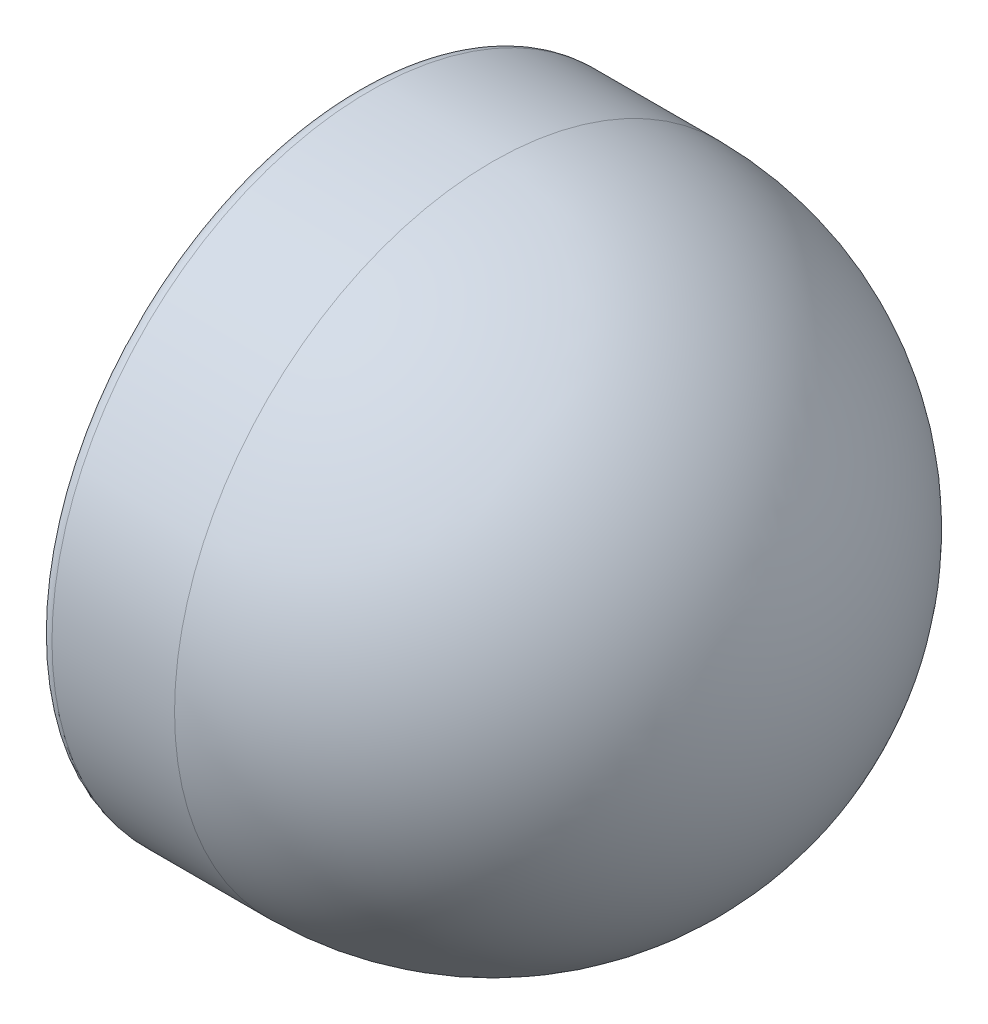
ISO-10303-21;
HEADER;
FILE_DESCRIPTION(('STEP AP214'),'2;1');
FILE_NAME('part.step','',(''),(''),'','','');
FILE_SCHEMA(('AUTOMOTIVE_DESIGN { 1 0 10303 214 1 1 1 1 }'));
ENDSEC;
DATA;
#1=APPLICATION_CONTEXT('core data for automotive mechanical design processes');
#2=APPLICATION_PROTOCOL_DEFINITION('international standard','automotive_design',2000,#1);
#3=PRODUCT_CONTEXT('',#1,'mechanical');
#4=PRODUCT('Part','Part','',(#3));
#5=PRODUCT_RELATED_PRODUCT_CATEGORY('part','',(#4));
#6=PRODUCT_DEFINITION_FORMATION('','',#4);
#7=PRODUCT_DEFINITION_CONTEXT('part definition',#1,'design');
#8=PRODUCT_DEFINITION('design','',#6,#7);
#9=PRODUCT_DEFINITION_SHAPE('','',#8);
#10=(LENGTH_UNIT() NAMED_UNIT(*) SI_UNIT(.MILLI.,.METRE.));
#11=(NAMED_UNIT(*) PLANE_ANGLE_UNIT() SI_UNIT($,.RADIAN.));
#12=(NAMED_UNIT(*) SI_UNIT($,.STERADIAN.) SOLID_ANGLE_UNIT());
#13=UNCERTAINTY_MEASURE_WITH_UNIT(LENGTH_MEASURE(1.E-05),#10,'distance_accuracy_value','');
#14=(GEOMETRIC_REPRESENTATION_CONTEXT(3) GLOBAL_UNCERTAINTY_ASSIGNED_CONTEXT((#13)) GLOBAL_UNIT_ASSIGNED_CONTEXT((#10,
#11,#12)) REPRESENTATION_CONTEXT('',''));
#15=CARTESIAN_POINT('',(0.,0.,0.));
#16=DIRECTION('',(0.,0.,1.));
#17=DIRECTION('',(1.,0.,0.));
#18=AXIS2_PLACEMENT_3D('',#15,#16,#17);
#19=CARTESIAN_POINT('',(-70.,0.,0.));
#20=DIRECTION('',(-1.,0.,0.));
#21=DIRECTION('',(0.,1.,0.));
#22=AXIS2_PLACEMENT_3D('',#19,#20,#21);
#23=SPHERICAL_SURFACE('',#22,70.);
#24=CARTESIAN_POINT('',(-70.,0.,0.));
#25=DIRECTION('',(-1.,0.,0.));
#26=DIRECTION('',(0.,0.,1.));
#27=AXIS2_PLACEMENT_3D('',#24,#25,#26);
#28=CIRCLE('',#27,70.);
#29=CARTESIAN_POINT('',(-70.,0.,70.));
#30=VERTEX_POINT('',#29);
#31=EDGE_CURVE('E10',#30,#30,#28,.T.);
#32=ORIENTED_EDGE('',*,*,#31,.F.);
#33=EDGE_LOOP('',(#32));
#34=FACE_BOUND('',#33,.T.);
#35=ADVANCED_FACE('F37',(#34),#23,.T.);
#36=CARTESIAN_POINT('',(-70.,0.,0.));
#37=DIRECTION('',(-1.,0.,0.));
#38=DIRECTION('',(0.,0.,1.));
#39=AXIS2_PLACEMENT_3D('',#36,#37,#38);
#40=CYLINDRICAL_SURFACE('',#39,70.);
#41=CARTESIAN_POINT('',(-97.,0.,0.));
#42=DIRECTION('',(-1.,0.,0.));
#43=DIRECTION('',(0.,0.,1.));
#44=AXIS2_PLACEMENT_3D('',#41,#42,#43);
#45=CIRCLE('',#44,70.);
#46=CARTESIAN_POINT('',(-97.,0.,70.));
#47=VERTEX_POINT('',#46);
#48=EDGE_CURVE('E44',#47,#47,#45,.T.);
#49=ORIENTED_EDGE('',*,*,#48,.F.);
#50=EDGE_LOOP('',(#49));
#51=FACE_BOUND('',#50,.T.);
#52=ORIENTED_EDGE('',*,*,#31,.T.);
#53=EDGE_LOOP('',(#52));
#54=FACE_BOUND('',#53,.T.);
#55=ADVANCED_FACE('F201',(#51,#54),#40,.T.);
#56=CARTESIAN_POINT('',(-97.,0.,0.));
#57=DIRECTION('',(-1.,0.,0.));
#58=DIRECTION('',(0.,0.,1.));
#59=AXIS2_PLACEMENT_3D('',#56,#57,#58);
#60=TOROIDAL_SURFACE('',#59,67.,3.);
#61=CARTESIAN_POINT('',(-100.,0.,0.));
#62=DIRECTION('',(-1.,0.,0.));
#63=DIRECTION('',(0.,0.,1.));
#64=AXIS2_PLACEMENT_3D('',#61,#62,#63);
#65=CIRCLE('',#64,67.);
#66=CARTESIAN_POINT('',(-100.,0.,67.));
#67=VERTEX_POINT('',#66);
#68=EDGE_CURVE('E49',#67,#67,#65,.T.);
#69=ORIENTED_EDGE('',*,*,#68,.F.);
#70=EDGE_LOOP('',(#69));
#71=FACE_BOUND('',#70,.T.);
#72=ORIENTED_EDGE('',*,*,#48,.T.);
#73=EDGE_LOOP('',(#72));
#74=FACE_BOUND('',#73,.T.);
#75=ADVANCED_FACE('F196',(#71,#74),#60,.T.);
#76=CARTESIAN_POINT('',(-100.,67.,0.));
#77=DIRECTION('',(1.,0.,0.));
#78=DIRECTION('',(0.,0.,-1.));
#79=AXIS2_PLACEMENT_3D('',#76,#77,#78);
#80=PLANE('',#79);
#81=CARTESIAN_POINT('',(-100.,0.,0.));
#82=DIRECTION('',(-1.,0.,0.));
#83=DIRECTION('',(0.,0.,1.));
#84=AXIS2_PLACEMENT_3D('',#81,#82,#83);
#85=CIRCLE('',#84,61.5);
#86=CARTESIAN_POINT('',(-100.,0.,61.5));
#87=VERTEX_POINT('',#86);
#88=EDGE_CURVE('E54',#87,#87,#85,.T.);
#89=ORIENTED_EDGE('',*,*,#88,.F.);
#90=EDGE_LOOP('',(#89));
#91=FACE_BOUND('',#90,.T.);
#92=ORIENTED_EDGE('',*,*,#68,.T.);
#93=EDGE_LOOP('',(#92));
#94=FACE_BOUND('',#93,.T.);
#95=ADVANCED_FACE('F190',(#91,#94),#80,.F.);
#96=CARTESIAN_POINT('',(-98.5,0.,0.));
#97=DIRECTION('',(-1.,0.,0.));
#98=DIRECTION('',(0.,0.,1.));
#99=AXIS2_PLACEMENT_3D('',#96,#97,#98);
#100=TOROIDAL_SURFACE('',#99,61.5,1.5);
#101=CARTESIAN_POINT('',(-98.5,0.,0.));
#102=DIRECTION('',(-1.,0.,0.));
#103=DIRECTION('',(0.,0.,1.));
#104=AXIS2_PLACEMENT_3D('',#101,#102,#103);
#105=CIRCLE('',#104,60.);
#106=CARTESIAN_POINT('',(-98.5,0.,60.));
#107=VERTEX_POINT('',#106);
#108=EDGE_CURVE('E60',#107,#107,#105,.T.);
#109=ORIENTED_EDGE('',*,*,#108,.F.);
#110=EDGE_LOOP('',(#109));
#111=FACE_BOUND('',#110,.T.);
#112=ORIENTED_EDGE('',*,*,#88,.T.);
#113=EDGE_LOOP('',(#112));
#114=FACE_BOUND('',#113,.T.);
#115=ADVANCED_FACE('F184',(#111,#114),#100,.T.);
#116=CARTESIAN_POINT('',(-70.,0.,0.));
#117=DIRECTION('',(-1.,0.,0.));
#118=DIRECTION('',(0.,0.,1.));
#119=AXIS2_PLACEMENT_3D('',#116,#117,#118);
#120=CYLINDRICAL_SURFACE('',#119,60.);
#121=CARTESIAN_POINT('',(-96.6213203435597,0.,0.));
#122=DIRECTION('',(-1.,0.,0.));
#123=DIRECTION('',(0.,0.,1.));
#124=AXIS2_PLACEMENT_3D('',#121,#122,#123);
#125=CIRCLE('',#124,60.);
#126=CARTESIAN_POINT('',(-96.6213203435597,0.,60.));
#127=VERTEX_POINT('',#126);
#128=EDGE_CURVE('E64',#127,#127,#125,.T.);
#129=ORIENTED_EDGE('',*,*,#128,.F.);
#130=EDGE_LOOP('',(#129));
#131=FACE_BOUND('',#130,.T.);
#132=ORIENTED_EDGE('',*,*,#108,.T.);
#133=EDGE_LOOP('',(#132));
#134=FACE_BOUND('',#133,.T.);
#135=ADVANCED_FACE('F178',(#131,#134),#120,.F.);
#136=CARTESIAN_POINT('',(-96.6213203435597,0.,0.));
#137=DIRECTION('',(-1.,0.,0.));
#138=DIRECTION('',(0.,0.,1.));
#139=AXIS2_PLACEMENT_3D('',#136,#137,#138);
#140=TOROIDAL_SURFACE('',#139,61.5,1.5);
#141=CARTESIAN_POINT('',(-95.5606601717798,0.,0.));
#142=DIRECTION('',(-1.,0.,0.));
#143=DIRECTION('',(0.,0.,1.));
#144=AXIS2_PLACEMENT_3D('',#141,#142,#143);
#145=CIRCLE('',#144,60.4393398282202);
#146=CARTESIAN_POINT('',(-95.5606601717798,0.,60.4393398282202));
#147=VERTEX_POINT('',#146);
#148=EDGE_CURVE('E68',#147,#147,#145,.T.);
#149=ORIENTED_EDGE('',*,*,#148,.F.);
#150=EDGE_LOOP('',(#149));
#151=FACE_BOUND('',#150,.T.);
#152=ORIENTED_EDGE('',*,*,#128,.T.);
#153=EDGE_LOOP('',(#152));
#154=FACE_BOUND('',#153,.T.);
#155=ADVANCED_FACE('F172',(#151,#154),#140,.T.);
#156=CARTESIAN_POINT('',(-95.5606601717798,0.,0.));
#157=DIRECTION('',(1.,0.,0.));
#158=DIRECTION('',(0.,0.,-1.));
#159=AXIS2_PLACEMENT_3D('',#156,#157,#158);
#160=CONICAL_SURFACE('',#159,60.4393398282202,0.785398163397449);
#161=CARTESIAN_POINT('',(-92.,0.,0.));
#162=DIRECTION('',(-1.,0.,0.));
#163=DIRECTION('',(0.,0.,1.));
#164=AXIS2_PLACEMENT_3D('',#161,#162,#163);
#165=CIRCLE('',#164,64.);
#166=CARTESIAN_POINT('',(-92.,0.,64.));
#167=VERTEX_POINT('',#166);
#168=EDGE_CURVE('E72',#167,#167,#165,.T.);
#169=ORIENTED_EDGE('',*,*,#168,.F.);
#170=EDGE_LOOP('',(#169));
#171=FACE_BOUND('',#170,.T.);
#172=ORIENTED_EDGE('',*,*,#148,.T.);
#173=EDGE_LOOP('',(#172));
#174=FACE_BOUND('',#173,.T.);
#175=ADVANCED_FACE('F166',(#171,#174),#160,.F.);
#176=CARTESIAN_POINT('',(-92.,64.,0.));
#177=DIRECTION('',(-1.,0.,0.));
#178=DIRECTION('',(0.,0.,1.));
#179=AXIS2_PLACEMENT_3D('',#176,#177,#178);
#180=PLANE('',#179);
#181=CARTESIAN_POINT('',(-92.,0.,0.));
#182=DIRECTION('',(-1.,0.,0.));
#183=DIRECTION('',(0.,0.,1.));
#184=AXIS2_PLACEMENT_3D('',#181,#182,#183);
#185=CIRCLE('',#184,64.7071067811866);
#186=CARTESIAN_POINT('',(-92.,0.,64.7071067811866));
#187=VERTEX_POINT('',#186);
#188=EDGE_CURVE('E76',#187,#187,#185,.T.);
#189=ORIENTED_EDGE('',*,*,#188,.F.);
#190=EDGE_LOOP('',(#189));
#191=FACE_BOUND('',#190,.T.);
#192=ORIENTED_EDGE('',*,*,#168,.T.);
#193=EDGE_LOOP('',(#192));
#194=FACE_BOUND('',#193,.T.);
#195=ADVANCED_FACE('F160',(#191,#194),#180,.F.);
#196=CARTESIAN_POINT('',(-70.,0.,0.));
#197=DIRECTION('',(-1.,0.,0.));
#198=DIRECTION('',(0.,0.,1.));
#199=AXIS2_PLACEMENT_3D('',#196,#197,#198);
#200=CYLINDRICAL_SURFACE('',#199,64.7071067811866);
#201=CARTESIAN_POINT('',(-92.7071067811866,0.,0.));
#202=DIRECTION('',(-1.,0.,0.));
#203=DIRECTION('',(0.,0.,1.));
#204=AXIS2_PLACEMENT_3D('',#201,#202,#203);
#205=CIRCLE('',#204,64.7071067811866);
#206=CARTESIAN_POINT('',(-92.7071067811866,0.,64.7071067811866));
#207=VERTEX_POINT('',#206);
#208=EDGE_CURVE('E80',#207,#207,#205,.T.);
#209=ORIENTED_EDGE('',*,*,#208,.F.);
#210=EDGE_LOOP('',(#209));
#211=FACE_BOUND('',#210,.T.);
#212=ORIENTED_EDGE('',*,*,#188,.T.);
#213=EDGE_LOOP('',(#212));
#214=FACE_BOUND('',#213,.T.);
#215=ADVANCED_FACE('F154',(#211,#214),#200,.T.);
#216=CARTESIAN_POINT('',(-92.7071067811866,0.,0.));
#217=DIRECTION('',(1.,0.,0.));
#218=DIRECTION('',(0.,0.,-1.));
#219=AXIS2_PLACEMENT_3D('',#216,#217,#218);
#220=CONICAL_SURFACE('',#219,64.7071067811866,0.785398163397447);
#221=CARTESIAN_POINT('',(-96.2677669529664,0.,0.));
#222=DIRECTION('',(-1.,0.,0.));
#223=DIRECTION('',(0.,0.,1.));
#224=AXIS2_PLACEMENT_3D('',#221,#222,#223);
#225=CIRCLE('',#224,61.1464466094067);
#226=CARTESIAN_POINT('',(-96.2677669529664,0.,61.1464466094067));
#227=VERTEX_POINT('',#226);
#228=EDGE_CURVE('E84',#227,#227,#225,.T.);
#229=ORIENTED_EDGE('',*,*,#228,.F.);
#230=EDGE_LOOP('',(#229));
#231=FACE_BOUND('',#230,.T.);
#232=ORIENTED_EDGE('',*,*,#208,.T.);
#233=EDGE_LOOP('',(#232));
#234=FACE_BOUND('',#233,.T.);
#235=ADVANCED_FACE('F148',(#231,#234),#220,.T.);
#236=CARTESIAN_POINT('',(-96.6213203435597,0.,0.));
#237=DIRECTION('',(-1.,0.,0.));
#238=DIRECTION('',(0.,0.,1.));
#239=AXIS2_PLACEMENT_3D('',#236,#237,#238);
#240=TOROIDAL_SURFACE('',#239,61.5,0.499999999999999);
#241=CARTESIAN_POINT('',(-96.6213203435597,0.,0.));
#242=DIRECTION('',(-1.,0.,0.));
#243=DIRECTION('',(0.,0.,1.));
#244=AXIS2_PLACEMENT_3D('',#241,#242,#243);
#245=CIRCLE('',#244,61.);
#246=CARTESIAN_POINT('',(-96.6213203435597,0.,61.));
#247=VERTEX_POINT('',#246);
#248=EDGE_CURVE('E88',#247,#247,#245,.T.);
#249=ORIENTED_EDGE('',*,*,#248,.F.);
#250=EDGE_LOOP('',(#249));
#251=FACE_BOUND('',#250,.T.);
#252=ORIENTED_EDGE('',*,*,#228,.T.);
#253=EDGE_LOOP('',(#252));
#254=FACE_BOUND('',#253,.T.);
#255=ADVANCED_FACE('F142',(#251,#254),#240,.F.);
#256=CARTESIAN_POINT('',(-70.,0.,0.));
#257=DIRECTION('',(-1.,0.,0.));
#258=DIRECTION('',(0.,0.,1.));
#259=AXIS2_PLACEMENT_3D('',#256,#257,#258);
#260=CYLINDRICAL_SURFACE('',#259,61.);
#261=CARTESIAN_POINT('',(-98.5,0.,0.));
#262=DIRECTION('',(-1.,0.,0.));
#263=DIRECTION('',(0.,0.,1.));
#264=AXIS2_PLACEMENT_3D('',#261,#262,#263);
#265=CIRCLE('',#264,61.);
#266=CARTESIAN_POINT('',(-98.5,0.,61.));
#267=VERTEX_POINT('',#266);
#268=EDGE_CURVE('E92',#267,#267,#265,.T.);
#269=ORIENTED_EDGE('',*,*,#268,.F.);
#270=EDGE_LOOP('',(#269));
#271=FACE_BOUND('',#270,.T.);
#272=ORIENTED_EDGE('',*,*,#248,.T.);
#273=EDGE_LOOP('',(#272));
#274=FACE_BOUND('',#273,.T.);
#275=ADVANCED_FACE('F136',(#271,#274),#260,.T.);
#276=CARTESIAN_POINT('',(-98.5,0.,0.));
#277=DIRECTION('',(-1.,0.,0.));
#278=DIRECTION('',(0.,0.,1.));
#279=AXIS2_PLACEMENT_3D('',#276,#277,#278);
#280=TOROIDAL_SURFACE('',#279,61.5,0.5);
#281=CARTESIAN_POINT('',(-99.,0.,0.));
#282=DIRECTION('',(-1.,0.,0.));
#283=DIRECTION('',(0.,0.,1.));
#284=AXIS2_PLACEMENT_3D('',#281,#282,#283);
#285=CIRCLE('',#284,61.5);
#286=CARTESIAN_POINT('',(-99.,0.,61.5));
#287=VERTEX_POINT('',#286);
#288=EDGE_CURVE('E96',#287,#287,#285,.T.);
#289=ORIENTED_EDGE('',*,*,#288,.F.);
#290=EDGE_LOOP('',(#289));
#291=FACE_BOUND('',#290,.T.);
#292=ORIENTED_EDGE('',*,*,#268,.T.);
#293=EDGE_LOOP('',(#292));
#294=FACE_BOUND('',#293,.T.);
#295=ADVANCED_FACE('F130',(#291,#294),#280,.F.);
#296=CARTESIAN_POINT('',(-99.,67.,0.));
#297=DIRECTION('',(-1.,0.,0.));
#298=DIRECTION('',(0.,0.,1.));
#299=AXIS2_PLACEMENT_3D('',#296,#297,#298);
#300=PLANE('',#299);
#301=CARTESIAN_POINT('',(-99.,0.,0.));
#302=DIRECTION('',(-1.,0.,0.));
#303=DIRECTION('',(0.,0.,1.));
#304=AXIS2_PLACEMENT_3D('',#301,#302,#303);
#305=CIRCLE('',#304,67.);
#306=CARTESIAN_POINT('',(-99.,0.,67.));
#307=VERTEX_POINT('',#306);
#308=EDGE_CURVE('E100',#307,#307,#305,.T.);
#309=ORIENTED_EDGE('',*,*,#308,.F.);
#310=EDGE_LOOP('',(#309));
#311=FACE_BOUND('',#310,.T.);
#312=ORIENTED_EDGE('',*,*,#288,.T.);
#313=EDGE_LOOP('',(#312));
#314=FACE_BOUND('',#313,.T.);
#315=ADVANCED_FACE('F124',(#311,#314),#300,.F.);
#316=CARTESIAN_POINT('',(-97.,0.,0.));
#317=DIRECTION('',(-1.,0.,0.));
#318=DIRECTION('',(0.,0.,1.));
#319=AXIS2_PLACEMENT_3D('',#316,#317,#318);
#320=TOROIDAL_SURFACE('',#319,67.,2.);
#321=CARTESIAN_POINT('',(-97.,0.,0.));
#322=DIRECTION('',(-1.,0.,0.));
#323=DIRECTION('',(0.,0.,1.));
#324=AXIS2_PLACEMENT_3D('',#321,#322,#323);
#325=CIRCLE('',#324,69.);
#326=CARTESIAN_POINT('',(-97.,0.,69.));
#327=VERTEX_POINT('',#326);
#328=EDGE_CURVE('E104',#327,#327,#325,.T.);
#329=ORIENTED_EDGE('',*,*,#328,.F.);
#330=EDGE_LOOP('',(#329));
#331=FACE_BOUND('',#330,.T.);
#332=ORIENTED_EDGE('',*,*,#308,.T.);
#333=EDGE_LOOP('',(#332));
#334=FACE_BOUND('',#333,.T.);
#335=ADVANCED_FACE('F118',(#331,#334),#320,.F.);
#336=CARTESIAN_POINT('',(-70.,0.,0.));
#337=DIRECTION('',(-1.,0.,0.));
#338=DIRECTION('',(0.,0.,1.));
#339=AXIS2_PLACEMENT_3D('',#336,#337,#338);
#340=CYLINDRICAL_SURFACE('',#339,69.);
#341=CARTESIAN_POINT('',(-70.,0.,0.));
#342=DIRECTION('',(-1.,0.,0.));
#343=DIRECTION('',(0.,0.,1.));
#344=AXIS2_PLACEMENT_3D('',#341,#342,#343);
#345=CIRCLE('',#344,69.);
#346=CARTESIAN_POINT('',(-70.,0.,69.));
#347=VERTEX_POINT('',#346);
#348=EDGE_CURVE('E108',#347,#347,#345,.T.);
#349=ORIENTED_EDGE('',*,*,#348,.F.);
#350=EDGE_LOOP('',(#349));
#351=FACE_BOUND('',#350,.T.);
#352=ORIENTED_EDGE('',*,*,#328,.T.);
#353=EDGE_LOOP('',(#352));
#354=FACE_BOUND('',#353,.T.);
#355=ADVANCED_FACE('F115',(#351,#354),#340,.F.);
#356=CARTESIAN_POINT('',(-70.,0.,0.));
#357=DIRECTION('',(-1.,0.,0.));
#358=DIRECTION('',(0.,1.,0.));
#359=AXIS2_PLACEMENT_3D('',#356,#357,#358);
#360=SPHERICAL_SURFACE('',#359,69.);
#361=ORIENTED_EDGE('',*,*,#348,.T.);
#362=EDGE_LOOP('',(#361));
#363=FACE_BOUND('',#362,.T.);
#364=ADVANCED_FACE('F113',(#363),#360,.F.);
#365=CLOSED_SHELL('',(#35,#55,#75,#95,#115,#135,#155,#175,#195,#215,#235,#255,#275,#295,#315,
#335,#355,#364));
#366=MANIFOLD_SOLID_BREP('B2',#365);
#367=ADVANCED_BREP_SHAPE_REPRESENTATION('',(#18,#366),#14);
#368=SHAPE_DEFINITION_REPRESENTATION(#9,#367);
ENDSEC;
END-ISO-10303-21;
